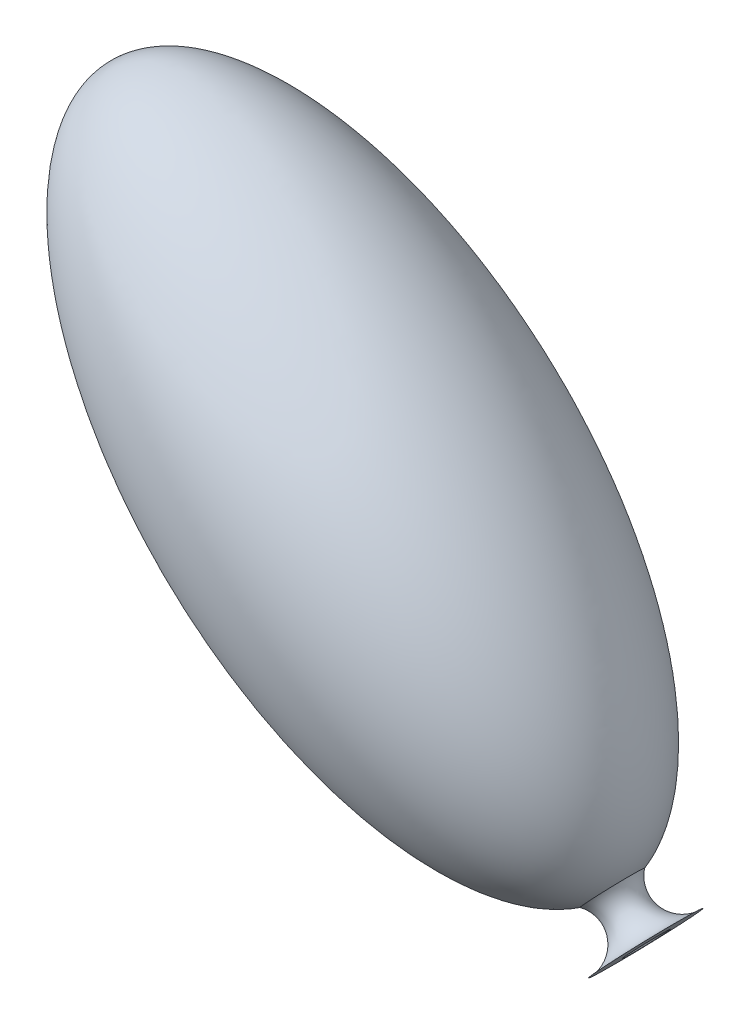
ISO-10303-21;
HEADER;
FILE_DESCRIPTION(('STEP AP214'),'2;1');
FILE_NAME('part.step','',(''),(''),'','','');
FILE_SCHEMA(('AUTOMOTIVE_DESIGN { 1 0 10303 214 1 1 1 1 }'));
ENDSEC;
DATA;
#1=APPLICATION_CONTEXT('core data for automotive mechanical design processes');
#2=APPLICATION_PROTOCOL_DEFINITION('international standard','automotive_design',2000,#1);
#3=PRODUCT_CONTEXT('',#1,'mechanical');
#4=PRODUCT('Part','Part','',(#3));
#5=PRODUCT_RELATED_PRODUCT_CATEGORY('part','',(#4));
#6=PRODUCT_DEFINITION_FORMATION('','',#4);
#7=PRODUCT_DEFINITION_CONTEXT('part definition',#1,'design');
#8=PRODUCT_DEFINITION('design','',#6,#7);
#9=PRODUCT_DEFINITION_SHAPE('','',#8);
#10=(LENGTH_UNIT() NAMED_UNIT(*) SI_UNIT(.MILLI.,.METRE.));
#11=(NAMED_UNIT(*) PLANE_ANGLE_UNIT() SI_UNIT($,.RADIAN.));
#12=(NAMED_UNIT(*) SI_UNIT($,.STERADIAN.) SOLID_ANGLE_UNIT());
#13=UNCERTAINTY_MEASURE_WITH_UNIT(LENGTH_MEASURE(1.E-05),#10,'distance_accuracy_value','');
#14=(GEOMETRIC_REPRESENTATION_CONTEXT(3) GLOBAL_UNCERTAINTY_ASSIGNED_CONTEXT((#13)) GLOBAL_UNIT_ASSIGNED_CONTEXT((#10,
#11,#12)) REPRESENTATION_CONTEXT('',''));
#15=CARTESIAN_POINT('',(0.,0.,0.));
#16=DIRECTION('',(0.,0.,1.));
#17=DIRECTION('',(1.,0.,0.));
#18=AXIS2_PLACEMENT_3D('',#15,#16,#17);
#19=CARTESIAN_POINT('',(13.7489027056373,-13.3309244896288,0.));
#20=DIRECTION('',(0.,0.,1.));
#21=DIRECTION('',(0.734733954005658,-0.678355376503505,0.));
#22=AXIS2_PLACEMENT_3D('',#19,#20,#21);
#23=ELLIPSE('',#22,60.5203050677298,27.4252159976296);
#24=TRIMMED_CURVE('',#23,(PARAMETER_VALUE(3.14159265358979)),
(PARAMETER_VALUE(6.28318530717958)),.T.,.PARAMETER.);
#25=CARTESIAN_POINT('',(-42.4973253713296,38.5993436244798,0.));
#26=DIRECTION('',(-0.734733954005658,0.678355376503505,0.));
#27=AXIS1_PLACEMENT('',#25,#26);
#28=SURFACE_OF_REVOLUTION('',#24,#27);
#29=CARTESIAN_POINT('',(57.5577121186261,-53.7781383981471,0.));
#30=DIRECTION('',(-0.734733954005658,0.678355376503505,0.));
#31=DIRECTION('',(-0.678355376503505,-0.734733954005658,0.));
#32=AXIS2_PLACEMENT_3D('',#29,#30,#31);
#33=CIRCLE('',#32,4.69883728228361);
#34=CARTESIAN_POINT('',(54.3702305848739,-57.2305336937886,0.));
#35=VERTEX_POINT('',#34);
#36=EDGE_CURVE('E11',#35,#35,#33,.T.);
#37=ORIENTED_EDGE('',*,*,#36,.T.);
#38=EDGE_LOOP('',(#37));
#39=FACE_BOUND('',#38,.T.);
#40=CARTESIAN_POINT('',(-30.7174203344044,27.7233498406981,0.));
#41=VERTEX_POINT('',#40);
#42=VERTEX_LOOP('',#41);
#43=FACE_BOUND('',#42,.T.);
#44=ADVANCED_FACE('F41',(#39,#43),#28,.F.);
#45=CARTESIAN_POINT('',(59.9467329373119,-55.9838417117058,0.));
#46=DIRECTION('',(-0.734733954005658,0.678355376503505,0.));
#47=DIRECTION('',(-0.678355376503505,-0.734733954005658,0.));
#48=AXIS2_PLACEMENT_3D('',#45,#46,#47);
#49=TOROIDAL_SURFACE('',#48,8.20977626015249,4.78531504562412);
#50=ORIENTED_EDGE('',*,*,#36,.F.);
#51=EDGE_LOOP('',(#50));
#52=FACE_BOUND('',#51,.T.);
#53=CARTESIAN_POINT('',(63.4615751006351,-59.2289783574979,0.));
#54=DIRECTION('',(-0.734733954005658,0.678355376503505,0.));
#55=DIRECTION('',(-0.678355376503505,-0.734733954005658,0.));
#56=AXIS2_PLACEMENT_3D('',#53,#54,#55);
#57=CIRCLE('',#56,8.32899372086574);
#58=CARTESIAN_POINT('',(57.8115574292219,-65.3485728469179,0.));
#59=VERTEX_POINT('',#58);
#60=EDGE_CURVE('E50',#59,#59,#57,.T.);
#61=ORIENTED_EDGE('',*,*,#60,.T.);
#62=EDGE_LOOP('',(#61));
#63=FACE_BOUND('',#62,.T.);
#64=ADVANCED_FACE('F68',(#52,#63),#49,.F.);
#65=CARTESIAN_POINT('',(63.6140810530764,-59.3697820214953,0.));
#66=DIRECTION('',(-0.734733954005658,0.678355376503505,0.));
#67=DIRECTION('',(-0.678355376503505,-0.734733954005658,0.));
#68=AXIS2_PLACEMENT_3D('',#65,#66,#67);
#69=CONICAL_SURFACE('',#68,0.,1.545880559408);
#70=CARTESIAN_POINT('',(63.5496298823638,-59.3102764032556,0.));
#71=DIRECTION('',(-0.734733954005658,0.678355376503505,0.));
#72=DIRECTION('',(-0.678355376503505,-0.734733954005658,0.));
#73=AXIS2_PLACEMENT_3D('',#70,#71,#72);
#74=CIRCLE('',#73,3.51995045160034);
#75=CARTESIAN_POINT('',(61.1618525684948,-61.896503516464,0.));
#76=VERTEX_POINT('',#75);
#77=EDGE_CURVE('E88',#76,#76,#74,.T.);
#78=ORIENTED_EDGE('',*,*,#77,.T.);
#79=EDGE_LOOP('',(#78));
#80=FACE_BOUND('',#79,.T.);
#81=ORIENTED_EDGE('',*,*,#60,.F.);
#82=EDGE_LOOP('',(#81));
#83=FACE_BOUND('',#82,.T.);
#84=ADVANCED_FACE('F59',(#80,#83),#69,.T.);
#85=CARTESIAN_POINT('',(13.7489027056373,-13.3309244896288,0.));
#86=DIRECTION('',(0.,0.,1.));
#87=DIRECTION('',(0.734733954005658,-0.678355376503505,0.));
#88=AXIS2_PLACEMENT_3D('',#85,#86,#87);
#89=ELLIPSE('',#88,60.5203050677298,27.4252159976296);
#90=TRIMMED_CURVE('',#89,(PARAMETER_VALUE(3.14159265358979)),
(PARAMETER_VALUE(6.28318530717958)),.T.,.PARAMETER.);
#91=CARTESIAN_POINT('',(-42.4973253713296,38.5993436244798,0.));
#92=DIRECTION('',(-0.734733954005658,0.678355376503505,0.));
#93=AXIS1_PLACEMENT('',#91,#92);
#94=SURFACE_OF_REVOLUTION('',#90,#93);
#95=OFFSET_SURFACE('',#94,2.,.F.);
#96=CARTESIAN_POINT('',(56.288276589576,-52.6061108750404,0.));
#97=DIRECTION('',(-0.734733954005658,0.678355376503505,0.));
#98=DIRECTION('',(-0.678355376503505,-0.734733954005658,0.));
#99=AXIS2_PLACEMENT_3D('',#96,#97,#98);
#100=CIRCLE('',#99,3.60031514033341);
#101=CARTESIAN_POINT('',(53.8459834570239,-55.251384653764,0.));
#102=VERTEX_POINT('',#101);
#103=EDGE_CURVE('E85',#102,#102,#100,.T.);
#104=ORIENTED_EDGE('',*,*,#103,.F.);
#105=EDGE_LOOP('',(#104));
#106=FACE_BOUND('',#105,.T.);
#107=CARTESIAN_POINT('',(-29.2479524263931,26.366639087691,0.));
#108=VERTEX_POINT('',#107);
#109=VERTEX_LOOP('',#108);
#110=FACE_BOUND('',#109,.T.);
#111=ADVANCED_FACE('F56',(#106,#110),#95,.T.);
#112=CARTESIAN_POINT('',(59.9467329373119,-55.9838417117058,0.));
#113=DIRECTION('',(-0.734733954005658,0.678355376503505,0.));
#114=DIRECTION('',(-0.678355376503505,-0.734733954005658,0.));
#115=AXIS2_PLACEMENT_3D('',#112,#113,#114);
#116=TOROIDAL_SURFACE('',#115,8.20977626015249,6.78531504562412);
#117=ORIENTED_EDGE('',*,*,#103,.T.);
#118=EDGE_LOOP('',(#117));
#119=FACE_BOUND('',#118,.T.);
#120=ORIENTED_EDGE('',*,*,#77,.F.);
#121=EDGE_LOOP('',(#120));
#122=FACE_BOUND('',#121,.T.);
#123=ADVANCED_FACE('F58',(#119,#122),#116,.T.);
#124=CLOSED_SHELL('',(#44,#64,#84,#111,#123));
#125=MANIFOLD_SOLID_BREP('B2',#124);
#126=ADVANCED_BREP_SHAPE_REPRESENTATION('',(#18,#125),#14);
#127=SHAPE_DEFINITION_REPRESENTATION(#9,#126);
ENDSEC;
END-ISO-10303-21;
